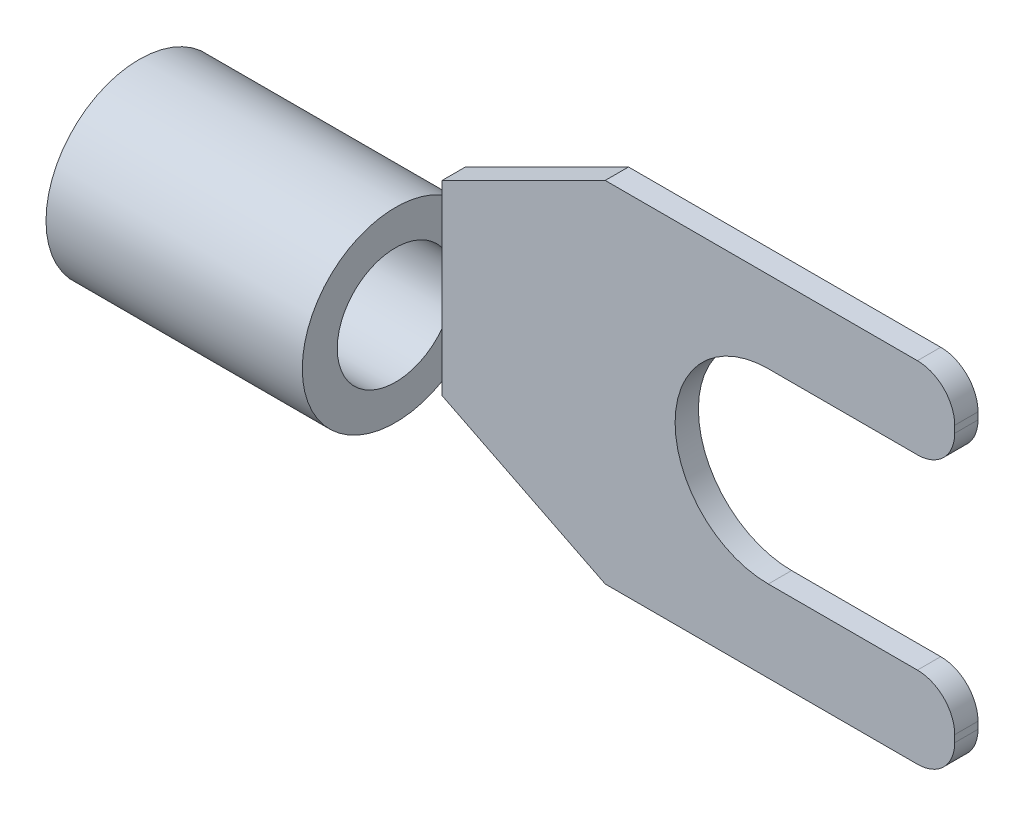
ISO-10303-21;
HEADER;
FILE_DESCRIPTION(('STEP AP214'),'2;1');
FILE_NAME('part.step','',(''),(''),'','','');
FILE_SCHEMA(('AUTOMOTIVE_DESIGN { 1 0 10303 214 1 1 1 1 }'));
ENDSEC;
DATA;
#1=APPLICATION_CONTEXT('core data for automotive mechanical design processes');
#2=APPLICATION_PROTOCOL_DEFINITION('international standard','automotive_design',2000,#1);
#3=PRODUCT_CONTEXT('',#1,'mechanical');
#4=PRODUCT('Part','Part','',(#3));
#5=PRODUCT_RELATED_PRODUCT_CATEGORY('part','',(#4));
#6=PRODUCT_DEFINITION_FORMATION('','',#4);
#7=PRODUCT_DEFINITION_CONTEXT('part definition',#1,'design');
#8=PRODUCT_DEFINITION('design','',#6,#7);
#9=PRODUCT_DEFINITION_SHAPE('','',#8);
#10=(LENGTH_UNIT() NAMED_UNIT(*) SI_UNIT(.MILLI.,.METRE.));
#11=(NAMED_UNIT(*) PLANE_ANGLE_UNIT() SI_UNIT($,.RADIAN.));
#12=(NAMED_UNIT(*) SI_UNIT($,.STERADIAN.) SOLID_ANGLE_UNIT());
#13=UNCERTAINTY_MEASURE_WITH_UNIT(LENGTH_MEASURE(1.E-05),#10,'distance_accuracy_value','');
#14=(GEOMETRIC_REPRESENTATION_CONTEXT(3) GLOBAL_UNCERTAINTY_ASSIGNED_CONTEXT((#13)) GLOBAL_UNIT_ASSIGNED_CONTEXT((#10,
#11,#12)) REPRESENTATION_CONTEXT('',''));
#15=CARTESIAN_POINT('',(0.,0.,0.));
#16=DIRECTION('',(0.,0.,1.));
#17=DIRECTION('',(1.,0.,0.));
#18=AXIS2_PLACEMENT_3D('',#15,#16,#17);
#19=CARTESIAN_POINT('',(0.,0.,0.5));
#20=DIRECTION('',(0.,0.,1.));
#21=DIRECTION('',(1.,0.,0.));
#22=AXIS2_PLACEMENT_3D('',#19,#20,#21);
#23=PLANE('',#22);
#24=DIRECTION('',(-0.894427190999916,-0.447213595499958,0.));
#25=VECTOR('',#24,1.);
#26=CARTESIAN_POINT('',(-3.5,3.75,0.5));
#27=LINE('',#26,#25);
#28=CARTESIAN_POINT('',(-3.5,3.75,0.5));
#29=VERTEX_POINT('',#28);
#30=CARTESIAN_POINT('',(-7.,2.,0.5));
#31=VERTEX_POINT('',#30);
#32=EDGE_CURVE('E256',#29,#31,#27,.T.);
#33=ORIENTED_EDGE('',*,*,#32,.T.);
#34=DIRECTION('',(0.,-1.,0.));
#35=VECTOR('',#34,1.);
#36=CARTESIAN_POINT('',(-7.,0.,0.5));
#37=LINE('',#36,#35);
#38=CARTESIAN_POINT('',(-7.,1.73205080756888,0.5));
#39=VERTEX_POINT('',#38);
#40=EDGE_CURVE('E294',#31,#39,#37,.T.);
#41=ORIENTED_EDGE('',*,*,#40,.T.);
#42=DIRECTION('',(0.,-1.,0.));
#43=VECTOR('',#42,1.);
#44=CARTESIAN_POINT('',(-7.,0.,0.5));
#45=LINE('',#44,#43);
#46=CARTESIAN_POINT('',(-7.,0.749999999999999,0.5));
#47=VERTEX_POINT('',#46);
#48=EDGE_CURVE('E174',#39,#47,#45,.T.);
#49=ORIENTED_EDGE('',*,*,#48,.T.);
#50=DIRECTION('',(0.,-1.,0.));
#51=VECTOR('',#50,1.);
#52=CARTESIAN_POINT('',(-7.,0.,0.5));
#53=LINE('',#52,#51);
#54=CARTESIAN_POINT('',(-7.,-0.749999999999999,0.5));
#55=VERTEX_POINT('',#54);
#56=EDGE_CURVE('E289',#47,#55,#53,.T.);
#57=ORIENTED_EDGE('',*,*,#56,.T.);
#58=CARTESIAN_POINT('',(-7.,-1.73205080756888,0.5));
#59=VERTEX_POINT('',#58);
#60=EDGE_CURVE('E275',#55,#59,#45,.T.);
#61=ORIENTED_EDGE('',*,*,#60,.T.);
#62=CARTESIAN_POINT('',(-7.,-2.,0.5));
#63=VERTEX_POINT('',#62);
#64=EDGE_CURVE('E295',#59,#63,#37,.T.);
#65=ORIENTED_EDGE('',*,*,#64,.T.);
#66=DIRECTION('',(0.894427190999916,-0.447213595499958,0.));
#67=VECTOR('',#66,1.);
#68=CARTESIAN_POINT('',(-3.5,-3.75,0.5));
#69=LINE('',#68,#67);
#70=CARTESIAN_POINT('',(-3.5,-3.75,0.5));
#71=VERTEX_POINT('',#70);
#72=EDGE_CURVE('E258',#63,#71,#69,.T.);
#73=ORIENTED_EDGE('',*,*,#72,.T.);
#74=DIRECTION('',(1.,0.,0.));
#75=VECTOR('',#74,1.);
#76=CARTESIAN_POINT('',(-3.5,-3.75,0.5));
#77=LINE('',#76,#75);
#78=CARTESIAN_POINT('',(3.2,-3.75,0.5));
#79=VERTEX_POINT('',#78);
#80=EDGE_CURVE('E260',#71,#79,#77,.T.);
#81=ORIENTED_EDGE('',*,*,#80,.T.);
#82=CARTESIAN_POINT('',(3.2,-2.95,0.5));
#83=DIRECTION('',(0.,0.,1.));
#84=DIRECTION('',(-1.,0.,0.));
#85=AXIS2_PLACEMENT_3D('',#82,#83,#84);
#86=CIRCLE('',#85,0.8);
#87=CARTESIAN_POINT('',(4.,-2.95,0.5));
#88=VERTEX_POINT('',#87);
#89=EDGE_CURVE('E149',#79,#88,#86,.T.);
#90=ORIENTED_EDGE('',*,*,#89,.T.);
#91=DIRECTION('',(0.,1.,0.));
#92=VECTOR('',#91,1.);
#93=CARTESIAN_POINT('',(4.,-2.95,0.5));
#94=LINE('',#93,#92);
#95=CARTESIAN_POINT('',(4.,-2.8,0.5));
#96=VERTEX_POINT('',#95);
#97=EDGE_CURVE('E142',#88,#96,#94,.T.);
#98=ORIENTED_EDGE('',*,*,#97,.T.);
#99=CARTESIAN_POINT('',(3.2,-2.8,0.5));
#100=DIRECTION('',(0.,0.,1.));
#101=DIRECTION('',(1.,0.,0.));
#102=AXIS2_PLACEMENT_3D('',#99,#100,#101);
#103=CIRCLE('',#102,0.8);
#104=CARTESIAN_POINT('',(3.2,-2.,0.5));
#105=VERTEX_POINT('',#104);
#106=EDGE_CURVE('E146',#96,#105,#103,.T.);
#107=ORIENTED_EDGE('',*,*,#106,.T.);
#108=DIRECTION('',(-1.,0.,0.));
#109=VECTOR('',#108,1.);
#110=CARTESIAN_POINT('',(0.,-2.,0.5));
#111=LINE('',#110,#109);
#112=CARTESIAN_POINT('',(0.,-2.,0.5));
#113=VERTEX_POINT('',#112);
#114=EDGE_CURVE('E58',#105,#113,#111,.T.);
#115=ORIENTED_EDGE('',*,*,#114,.T.);
#116=CARTESIAN_POINT('',(0.,0.,0.5));
#117=DIRECTION('',(0.,0.,-1.));
#118=DIRECTION('',(1.,0.,0.));
#119=AXIS2_PLACEMENT_3D('',#116,#117,#118);
#120=CIRCLE('',#119,2.);
#121=CARTESIAN_POINT('',(0.,2.,0.5));
#122=VERTEX_POINT('',#121);
#123=EDGE_CURVE('E197',#113,#122,#120,.T.);
#124=ORIENTED_EDGE('',*,*,#123,.T.);
#125=DIRECTION('',(1.,0.,0.));
#126=VECTOR('',#125,1.);
#127=CARTESIAN_POINT('',(0.,2.,0.5));
#128=LINE('',#127,#126);
#129=CARTESIAN_POINT('',(3.2,2.,0.5));
#130=VERTEX_POINT('',#129);
#131=EDGE_CURVE('E115',#122,#130,#128,.T.);
#132=ORIENTED_EDGE('',*,*,#131,.T.);
#133=CARTESIAN_POINT('',(3.2,2.8,0.5));
#134=DIRECTION('',(0.,0.,1.));
#135=DIRECTION('',(-1.,0.,0.));
#136=AXIS2_PLACEMENT_3D('',#133,#134,#135);
#137=CIRCLE('',#136,0.8);
#138=CARTESIAN_POINT('',(4.,2.8,0.5));
#139=VERTEX_POINT('',#138);
#140=EDGE_CURVE('E248',#130,#139,#137,.T.);
#141=ORIENTED_EDGE('',*,*,#140,.T.);
#142=DIRECTION('',(0.,1.,0.));
#143=VECTOR('',#142,1.);
#144=CARTESIAN_POINT('',(4.,2.95,0.5));
#145=LINE('',#144,#143);
#146=CARTESIAN_POINT('',(4.,2.95,0.5));
#147=VERTEX_POINT('',#146);
#148=EDGE_CURVE('E245',#139,#147,#145,.T.);
#149=ORIENTED_EDGE('',*,*,#148,.T.);
#150=CARTESIAN_POINT('',(3.2,2.95,0.5));
#151=DIRECTION('',(0.,0.,1.));
#152=DIRECTION('',(1.,0.,0.));
#153=AXIS2_PLACEMENT_3D('',#150,#151,#152);
#154=CIRCLE('',#153,0.8);
#155=CARTESIAN_POINT('',(3.2,3.75,0.5));
#156=VERTEX_POINT('',#155);
#157=EDGE_CURVE('E247',#147,#156,#154,.T.);
#158=ORIENTED_EDGE('',*,*,#157,.T.);
#159=DIRECTION('',(-1.,0.,0.));
#160=VECTOR('',#159,1.);
#161=CARTESIAN_POINT('',(-3.5,3.75,0.5));
#162=LINE('',#161,#160);
#163=EDGE_CURVE('E250',#156,#29,#162,.T.);
#164=ORIENTED_EDGE('',*,*,#163,.T.);
#165=EDGE_LOOP('',(#33,#41,#49,#57,#61,#65,#73,#81,#90,#98,#107,#115,#124,#132,#141,#149,#158,#164));
#166=FACE_BOUND('',#165,.T.);
#167=ADVANCED_FACE('F35',(#166),#23,.T.);
#168=CARTESIAN_POINT('',(-12.5,2.,0.5));
#169=DIRECTION('',(1.,0.,0.));
#170=DIRECTION('',(0.,0.,-1.));
#171=AXIS2_PLACEMENT_3D('',#168,#169,#170);
#172=PLANE('',#171);
#173=CARTESIAN_POINT('',(-12.5,0.,1.5));
#174=DIRECTION('',(-1.,0.,0.));
#175=DIRECTION('',(0.,0.,1.));
#176=AXIS2_PLACEMENT_3D('',#173,#174,#175);
#177=CIRCLE('',#176,1.25);
#178=CARTESIAN_POINT('',(-12.5,0.,2.75));
#179=VERTEX_POINT('',#178);
#180=EDGE_CURVE('E286',#179,#179,#177,.T.);
#181=ORIENTED_EDGE('',*,*,#180,.F.);
#182=EDGE_LOOP('',(#181));
#183=FACE_BOUND('',#182,.T.);
#184=CARTESIAN_POINT('',(-12.5,0.,1.5));
#185=DIRECTION('',(-1.,0.,0.));
#186=DIRECTION('',(0.,0.,1.));
#187=AXIS2_PLACEMENT_3D('',#184,#185,#186);
#188=CIRCLE('',#187,2.);
#189=CARTESIAN_POINT('',(-12.5,0.,3.5));
#190=VERTEX_POINT('',#189);
#191=EDGE_CURVE('E279',#190,#190,#188,.T.);
#192=ORIENTED_EDGE('',*,*,#191,.T.);
#193=EDGE_LOOP('',(#192));
#194=FACE_BOUND('',#193,.T.);
#195=ADVANCED_FACE('F363',(#183,#194),#172,.F.);
#196=CARTESIAN_POINT('',(0.,0.,0.));
#197=DIRECTION('',(0.,0.,1.));
#198=DIRECTION('',(1.,0.,0.));
#199=AXIS2_PLACEMENT_3D('',#196,#197,#198);
#200=PLANE('',#199);
#201=DIRECTION('',(0.,-1.,0.));
#202=VECTOR('',#201,1.);
#203=CARTESIAN_POINT('',(-7.,0.,0.));
#204=LINE('',#203,#202);
#205=CARTESIAN_POINT('',(-7.,2.,0.));
#206=VERTEX_POINT('',#205);
#207=CARTESIAN_POINT('',(-7.,1.3228756555323,0.));
#208=VERTEX_POINT('',#207);
#209=EDGE_CURVE('E297',#206,#208,#204,.T.);
#210=ORIENTED_EDGE('',*,*,#209,.F.);
#211=DIRECTION('',(-0.894427190999916,-0.447213595499958,0.));
#212=VECTOR('',#211,1.);
#213=CARTESIAN_POINT('',(-3.5,3.75,0.));
#214=LINE('',#213,#212);
#215=CARTESIAN_POINT('',(-3.5,3.75,0.));
#216=VERTEX_POINT('',#215);
#217=EDGE_CURVE('E184',#216,#206,#214,.T.);
#218=ORIENTED_EDGE('',*,*,#217,.F.);
#219=DIRECTION('',(-1.,0.,0.));
#220=VECTOR('',#219,1.);
#221=CARTESIAN_POINT('',(-3.5,3.75,0.));
#222=LINE('',#221,#220);
#223=CARTESIAN_POINT('',(3.2,3.75,0.));
#224=VERTEX_POINT('',#223);
#225=EDGE_CURVE('E182',#224,#216,#222,.T.);
#226=ORIENTED_EDGE('',*,*,#225,.F.);
#227=CARTESIAN_POINT('',(3.2,2.95,0.));
#228=DIRECTION('',(0.,0.,1.));
#229=DIRECTION('',(1.,0.,0.));
#230=AXIS2_PLACEMENT_3D('',#227,#228,#229);
#231=CIRCLE('',#230,0.8);
#232=CARTESIAN_POINT('',(4.,2.95,0.));
#233=VERTEX_POINT('',#232);
#234=EDGE_CURVE('E180',#233,#224,#231,.T.);
#235=ORIENTED_EDGE('',*,*,#234,.F.);
#236=DIRECTION('',(0.,1.,0.));
#237=VECTOR('',#236,1.);
#238=CARTESIAN_POINT('',(4.,2.95,0.));
#239=LINE('',#238,#237);
#240=CARTESIAN_POINT('',(4.,2.8,0.));
#241=VERTEX_POINT('',#240);
#242=EDGE_CURVE('E178',#241,#233,#239,.T.);
#243=ORIENTED_EDGE('',*,*,#242,.F.);
#244=CARTESIAN_POINT('',(3.2,2.8,0.));
#245=DIRECTION('',(0.,0.,1.));
#246=DIRECTION('',(-1.,0.,0.));
#247=AXIS2_PLACEMENT_3D('',#244,#245,#246);
#248=CIRCLE('',#247,0.8);
#249=CARTESIAN_POINT('',(3.2,2.,0.));
#250=VERTEX_POINT('',#249);
#251=EDGE_CURVE('E176',#250,#241,#248,.T.);
#252=ORIENTED_EDGE('',*,*,#251,.F.);
#253=DIRECTION('',(1.,0.,0.));
#254=VECTOR('',#253,1.);
#255=CARTESIAN_POINT('',(0.,2.,0.));
#256=LINE('',#255,#254);
#257=CARTESIAN_POINT('',(0.,2.,0.));
#258=VERTEX_POINT('',#257);
#259=EDGE_CURVE('E173',#258,#250,#256,.T.);
#260=ORIENTED_EDGE('',*,*,#259,.F.);
#261=CARTESIAN_POINT('',(0.,0.,0.));
#262=DIRECTION('',(0.,0.,-1.));
#263=DIRECTION('',(1.,0.,0.));
#264=AXIS2_PLACEMENT_3D('',#261,#262,#263);
#265=CIRCLE('',#264,2.);
#266=CARTESIAN_POINT('',(0.,-2.,0.));
#267=VERTEX_POINT('',#266);
#268=EDGE_CURVE('E170',#267,#258,#265,.T.);
#269=ORIENTED_EDGE('',*,*,#268,.F.);
#270=DIRECTION('',(-1.,0.,0.));
#271=VECTOR('',#270,1.);
#272=CARTESIAN_POINT('',(0.,-2.,0.));
#273=LINE('',#272,#271);
#274=CARTESIAN_POINT('',(3.2,-2.,0.));
#275=VERTEX_POINT('',#274);
#276=EDGE_CURVE('E106',#275,#267,#273,.T.);
#277=ORIENTED_EDGE('',*,*,#276,.F.);
#278=CARTESIAN_POINT('',(3.2,-2.8,0.));
#279=DIRECTION('',(0.,0.,1.));
#280=DIRECTION('',(1.,0.,0.));
#281=AXIS2_PLACEMENT_3D('',#278,#279,#280);
#282=CIRCLE('',#281,0.8);
#283=CARTESIAN_POINT('',(4.,-2.8,0.));
#284=VERTEX_POINT('',#283);
#285=EDGE_CURVE('E194',#284,#275,#282,.T.);
#286=ORIENTED_EDGE('',*,*,#285,.F.);
#287=DIRECTION('',(0.,1.,0.));
#288=VECTOR('',#287,1.);
#289=CARTESIAN_POINT('',(4.,-2.95,0.));
#290=LINE('',#289,#288);
#291=CARTESIAN_POINT('',(4.,-2.95,0.));
#292=VERTEX_POINT('',#291);
#293=EDGE_CURVE('E158',#292,#284,#290,.T.);
#294=ORIENTED_EDGE('',*,*,#293,.F.);
#295=CARTESIAN_POINT('',(3.2,-2.95,0.));
#296=DIRECTION('',(0.,0.,1.));
#297=DIRECTION('',(-1.,0.,0.));
#298=AXIS2_PLACEMENT_3D('',#295,#296,#297);
#299=CIRCLE('',#298,0.8);
#300=CARTESIAN_POINT('',(3.2,-3.75,0.));
#301=VERTEX_POINT('',#300);
#302=EDGE_CURVE('E191',#301,#292,#299,.T.);
#303=ORIENTED_EDGE('',*,*,#302,.F.);
#304=DIRECTION('',(1.,0.,0.));
#305=VECTOR('',#304,1.);
#306=CARTESIAN_POINT('',(-3.5,-3.75,0.));
#307=LINE('',#306,#305);
#308=CARTESIAN_POINT('',(-3.5,-3.75,0.));
#309=VERTEX_POINT('',#308);
#310=EDGE_CURVE('E189',#309,#301,#307,.T.);
#311=ORIENTED_EDGE('',*,*,#310,.F.);
#312=DIRECTION('',(0.894427190999916,-0.447213595499958,0.));
#313=VECTOR('',#312,1.);
#314=CARTESIAN_POINT('',(-3.5,-3.75,0.));
#315=LINE('',#314,#313);
#316=CARTESIAN_POINT('',(-7.,-2.,0.));
#317=VERTEX_POINT('',#316);
#318=EDGE_CURVE('E187',#317,#309,#315,.T.);
#319=ORIENTED_EDGE('',*,*,#318,.F.);
#320=CARTESIAN_POINT('',(-7.,-1.3228756555323,0.));
#321=VERTEX_POINT('',#320);
#322=EDGE_CURVE('E298',#321,#317,#204,.T.);
#323=ORIENTED_EDGE('',*,*,#322,.F.);
#324=DIRECTION('',(0.,-1.,0.));
#325=VECTOR('',#324,1.);
#326=CARTESIAN_POINT('',(-7.,0.,0.));
#327=LINE('',#326,#325);
#328=EDGE_CURVE('E11',#208,#321,#327,.T.);
#329=ORIENTED_EDGE('',*,*,#328,.F.);
#330=EDGE_LOOP('',(#210,#218,#226,#235,#243,#252,#260,#269,#277,#286,#294,#303,#311,#319,#323,#329));
#331=FACE_BOUND('',#330,.T.);
#332=ADVANCED_FACE('F233',(#331),#200,.F.);
#333=CARTESIAN_POINT('',(0.,0.,0.5));
#334=DIRECTION('',(0.,0.,-1.));
#335=DIRECTION('',(-1.,0.,0.));
#336=AXIS2_PLACEMENT_3D('',#333,#334,#335);
#337=CYLINDRICAL_SURFACE('',#336,2.);
#338=ORIENTED_EDGE('',*,*,#268,.T.);
#339=DIRECTION('',(0.,0.,-1.));
#340=VECTOR('',#339,1.);
#341=CARTESIAN_POINT('',(0.,2.,0.5));
#342=LINE('',#341,#340);
#343=EDGE_CURVE('E43',#122,#258,#342,.T.);
#344=ORIENTED_EDGE('',*,*,#343,.F.);
#345=ORIENTED_EDGE('',*,*,#123,.F.);
#346=DIRECTION('',(0.,0.,-1.));
#347=VECTOR('',#346,1.);
#348=CARTESIAN_POINT('',(0.,-2.,0.5));
#349=LINE('',#348,#347);
#350=EDGE_CURVE('E166',#113,#267,#349,.T.);
#351=ORIENTED_EDGE('',*,*,#350,.T.);
#352=EDGE_LOOP('',(#338,#344,#345,#351));
#353=FACE_BOUND('',#352,.T.);
#354=ADVANCED_FACE('F37',(#353),#337,.F.);
#355=CARTESIAN_POINT('',(0.,2.,0.5));
#356=DIRECTION('',(0.,1.,0.));
#357=DIRECTION('',(0.,0.,1.));
#358=AXIS2_PLACEMENT_3D('',#355,#356,#357);
#359=PLANE('',#358);
#360=ORIENTED_EDGE('',*,*,#259,.T.);
#361=DIRECTION('',(0.,0.,-1.));
#362=VECTOR('',#361,1.);
#363=CARTESIAN_POINT('',(3.2,2.,0.5));
#364=LINE('',#363,#362);
#365=EDGE_CURVE('E224',#130,#250,#364,.T.);
#366=ORIENTED_EDGE('',*,*,#365,.F.);
#367=ORIENTED_EDGE('',*,*,#131,.F.);
#368=ORIENTED_EDGE('',*,*,#343,.T.);
#369=EDGE_LOOP('',(#360,#366,#367,#368));
#370=FACE_BOUND('',#369,.T.);
#371=ADVANCED_FACE('F227',(#370),#359,.F.);
#372=CARTESIAN_POINT('',(3.2,2.8,0.5));
#373=DIRECTION('',(0.,0.,-1.));
#374=DIRECTION('',(-1.,0.,0.));
#375=AXIS2_PLACEMENT_3D('',#372,#373,#374);
#376=CYLINDRICAL_SURFACE('',#375,0.8);
#377=ORIENTED_EDGE('',*,*,#251,.T.);
#378=DIRECTION('',(0.,0.,-1.));
#379=VECTOR('',#378,1.);
#380=CARTESIAN_POINT('',(4.,2.8,0.5));
#381=LINE('',#380,#379);
#382=EDGE_CURVE('E221',#139,#241,#381,.T.);
#383=ORIENTED_EDGE('',*,*,#382,.F.);
#384=ORIENTED_EDGE('',*,*,#140,.F.);
#385=ORIENTED_EDGE('',*,*,#365,.T.);
#386=EDGE_LOOP('',(#377,#383,#384,#385));
#387=FACE_BOUND('',#386,.T.);
#388=ADVANCED_FACE('F239',(#387),#376,.T.);
#389=CARTESIAN_POINT('',(4.,2.95,0.5));
#390=DIRECTION('',(-1.,0.,0.));
#391=DIRECTION('',(0.,0.,1.));
#392=AXIS2_PLACEMENT_3D('',#389,#390,#391);
#393=PLANE('',#392);
#394=ORIENTED_EDGE('',*,*,#242,.T.);
#395=DIRECTION('',(0.,0.,-1.));
#396=VECTOR('',#395,1.);
#397=CARTESIAN_POINT('',(4.,2.95,0.5));
#398=LINE('',#397,#396);
#399=EDGE_CURVE('E218',#147,#233,#398,.T.);
#400=ORIENTED_EDGE('',*,*,#399,.F.);
#401=ORIENTED_EDGE('',*,*,#148,.F.);
#402=ORIENTED_EDGE('',*,*,#382,.T.);
#403=EDGE_LOOP('',(#394,#400,#401,#402));
#404=FACE_BOUND('',#403,.T.);
#405=ADVANCED_FACE('F243',(#404),#393,.F.);
#406=CARTESIAN_POINT('',(3.2,2.95,0.5));
#407=DIRECTION('',(0.,0.,-1.));
#408=DIRECTION('',(-1.,0.,0.));
#409=AXIS2_PLACEMENT_3D('',#406,#407,#408);
#410=CYLINDRICAL_SURFACE('',#409,0.8);
#411=ORIENTED_EDGE('',*,*,#234,.T.);
#412=DIRECTION('',(0.,0.,-1.));
#413=VECTOR('',#412,1.);
#414=CARTESIAN_POINT('',(3.2,3.75,0.5));
#415=LINE('',#414,#413);
#416=EDGE_CURVE('E215',#156,#224,#415,.T.);
#417=ORIENTED_EDGE('',*,*,#416,.F.);
#418=ORIENTED_EDGE('',*,*,#157,.F.);
#419=ORIENTED_EDGE('',*,*,#399,.T.);
#420=EDGE_LOOP('',(#411,#417,#418,#419));
#421=FACE_BOUND('',#420,.T.);
#422=ADVANCED_FACE('F390',(#421),#410,.T.);
#423=CARTESIAN_POINT('',(-3.5,3.75,0.5));
#424=DIRECTION('',(0.,-1.,0.));
#425=DIRECTION('',(0.,0.,-1.));
#426=AXIS2_PLACEMENT_3D('',#423,#424,#425);
#427=PLANE('',#426);
#428=ORIENTED_EDGE('',*,*,#225,.T.);
#429=DIRECTION('',(0.,0.,-1.));
#430=VECTOR('',#429,1.);
#431=CARTESIAN_POINT('',(-3.5,3.75,0.5));
#432=LINE('',#431,#430);
#433=EDGE_CURVE('E212',#29,#216,#432,.T.);
#434=ORIENTED_EDGE('',*,*,#433,.F.);
#435=ORIENTED_EDGE('',*,*,#163,.F.);
#436=ORIENTED_EDGE('',*,*,#416,.T.);
#437=EDGE_LOOP('',(#428,#434,#435,#436));
#438=FACE_BOUND('',#437,.T.);
#439=ADVANCED_FACE('F386',(#438),#427,.F.);
#440=CARTESIAN_POINT('',(-3.5,3.75,0.5));
#441=DIRECTION('',(0.447213595499958,-0.894427190999916,0.));
#442=DIRECTION('',(0.894427190999916,0.447213595499958,0.));
#443=AXIS2_PLACEMENT_3D('',#440,#441,#442);
#444=PLANE('',#443);
#445=ORIENTED_EDGE('',*,*,#217,.T.);
#446=DIRECTION('',(0.,0.,-1.));
#447=VECTOR('',#446,1.);
#448=CARTESIAN_POINT('',(-7.,2.,0.5));
#449=LINE('',#448,#447);
#450=EDGE_CURVE('E210',#31,#206,#449,.T.);
#451=ORIENTED_EDGE('',*,*,#450,.F.);
#452=ORIENTED_EDGE('',*,*,#32,.F.);
#453=ORIENTED_EDGE('',*,*,#433,.T.);
#454=EDGE_LOOP('',(#445,#451,#452,#453));
#455=FACE_BOUND('',#454,.T.);
#456=ADVANCED_FACE('F382',(#455),#444,.F.);
#457=CARTESIAN_POINT('',(-3.5,-3.75,0.5));
#458=DIRECTION('',(0.447213595499958,0.894427190999916,0.));
#459=DIRECTION('',(-0.894427190999916,0.447213595499958,0.));
#460=AXIS2_PLACEMENT_3D('',#457,#458,#459);
#461=PLANE('',#460);
#462=ORIENTED_EDGE('',*,*,#318,.T.);
#463=DIRECTION('',(0.,0.,-1.));
#464=VECTOR('',#463,1.);
#465=CARTESIAN_POINT('',(-3.5,-3.75,0.5));
#466=LINE('',#465,#464);
#467=EDGE_CURVE('E204',#71,#309,#466,.T.);
#468=ORIENTED_EDGE('',*,*,#467,.F.);
#469=ORIENTED_EDGE('',*,*,#72,.F.);
#470=DIRECTION('',(0.,0.,-1.));
#471=VECTOR('',#470,1.);
#472=CARTESIAN_POINT('',(-7.,-2.,0.5));
#473=LINE('',#472,#471);
#474=EDGE_CURVE('E207',#63,#317,#473,.T.);
#475=ORIENTED_EDGE('',*,*,#474,.T.);
#476=EDGE_LOOP('',(#462,#468,#469,#475));
#477=FACE_BOUND('',#476,.T.);
#478=ADVANCED_FACE('F346',(#477),#461,.F.);
#479=CARTESIAN_POINT('',(-3.5,-3.75,0.5));
#480=DIRECTION('',(0.,1.,0.));
#481=DIRECTION('',(0.,0.,1.));
#482=AXIS2_PLACEMENT_3D('',#479,#480,#481);
#483=PLANE('',#482);
#484=ORIENTED_EDGE('',*,*,#310,.T.);
#485=DIRECTION('',(0.,0.,-1.));
#486=VECTOR('',#485,1.);
#487=CARTESIAN_POINT('',(3.2,-3.75,0.5));
#488=LINE('',#487,#486);
#489=EDGE_CURVE('E201',#79,#301,#488,.T.);
#490=ORIENTED_EDGE('',*,*,#489,.F.);
#491=ORIENTED_EDGE('',*,*,#80,.F.);
#492=ORIENTED_EDGE('',*,*,#467,.T.);
#493=EDGE_LOOP('',(#484,#490,#491,#492));
#494=FACE_BOUND('',#493,.T.);
#495=ADVANCED_FACE('F267',(#494),#483,.F.);
#496=CARTESIAN_POINT('',(3.2,-2.95,0.5));
#497=DIRECTION('',(0.,0.,-1.));
#498=DIRECTION('',(-1.,0.,0.));
#499=AXIS2_PLACEMENT_3D('',#496,#497,#498);
#500=CYLINDRICAL_SURFACE('',#499,0.8);
#501=ORIENTED_EDGE('',*,*,#302,.T.);
#502=DIRECTION('',(0.,0.,-1.));
#503=VECTOR('',#502,1.);
#504=CARTESIAN_POINT('',(4.,-2.95,0.5));
#505=LINE('',#504,#503);
#506=EDGE_CURVE('E161',#88,#292,#505,.T.);
#507=ORIENTED_EDGE('',*,*,#506,.F.);
#508=ORIENTED_EDGE('',*,*,#89,.F.);
#509=ORIENTED_EDGE('',*,*,#489,.T.);
#510=EDGE_LOOP('',(#501,#507,#508,#509));
#511=FACE_BOUND('',#510,.T.);
#512=ADVANCED_FACE('F271',(#511),#500,.T.);
#513=CARTESIAN_POINT('',(4.,-2.95,0.5));
#514=DIRECTION('',(-1.,0.,0.));
#515=DIRECTION('',(0.,0.,1.));
#516=AXIS2_PLACEMENT_3D('',#513,#514,#515);
#517=PLANE('',#516);
#518=ORIENTED_EDGE('',*,*,#293,.T.);
#519=DIRECTION('',(0.,0.,-1.));
#520=VECTOR('',#519,1.);
#521=CARTESIAN_POINT('',(4.,-2.8,0.5));
#522=LINE('',#521,#520);
#523=EDGE_CURVE('E155',#96,#284,#522,.T.);
#524=ORIENTED_EDGE('',*,*,#523,.F.);
#525=ORIENTED_EDGE('',*,*,#97,.F.);
#526=ORIENTED_EDGE('',*,*,#506,.T.);
#527=EDGE_LOOP('',(#518,#524,#525,#526));
#528=FACE_BOUND('',#527,.T.);
#529=ADVANCED_FACE('F156',(#528),#517,.F.);
#530=CARTESIAN_POINT('',(3.2,-2.8,0.5));
#531=DIRECTION('',(0.,0.,-1.));
#532=DIRECTION('',(-1.,0.,0.));
#533=AXIS2_PLACEMENT_3D('',#530,#531,#532);
#534=CYLINDRICAL_SURFACE('',#533,0.8);
#535=ORIENTED_EDGE('',*,*,#285,.T.);
#536=DIRECTION('',(0.,0.,-1.));
#537=VECTOR('',#536,1.);
#538=CARTESIAN_POINT('',(3.2,-2.,0.5));
#539=LINE('',#538,#537);
#540=EDGE_CURVE('E162',#105,#275,#539,.T.);
#541=ORIENTED_EDGE('',*,*,#540,.F.);
#542=ORIENTED_EDGE('',*,*,#106,.F.);
#543=ORIENTED_EDGE('',*,*,#523,.T.);
#544=EDGE_LOOP('',(#535,#541,#542,#543));
#545=FACE_BOUND('',#544,.T.);
#546=ADVANCED_FACE('F164',(#545),#534,.T.);
#547=CARTESIAN_POINT('',(0.,-2.,0.5));
#548=DIRECTION('',(0.,-1.,0.));
#549=DIRECTION('',(0.,0.,-1.));
#550=AXIS2_PLACEMENT_3D('',#547,#548,#549);
#551=PLANE('',#550);
#552=ORIENTED_EDGE('',*,*,#276,.T.);
#553=ORIENTED_EDGE('',*,*,#350,.F.);
#554=ORIENTED_EDGE('',*,*,#114,.F.);
#555=ORIENTED_EDGE('',*,*,#540,.T.);
#556=EDGE_LOOP('',(#552,#553,#554,#555));
#557=FACE_BOUND('',#556,.T.);
#558=ADVANCED_FACE('F272',(#557),#551,.F.);
#559=CARTESIAN_POINT('',(-7.,0.,1.5));
#560=DIRECTION('',(-1.,0.,0.));
#561=DIRECTION('',(0.,0.,1.));
#562=AXIS2_PLACEMENT_3D('',#559,#560,#561);
#563=PLANE('',#562);
#564=CARTESIAN_POINT('',(-7.,0.,1.5));
#565=DIRECTION('',(-1.,0.,0.));
#566=DIRECTION('',(0.,0.,1.));
#567=AXIS2_PLACEMENT_3D('',#564,#565,#566);
#568=CIRCLE('',#567,2.);
#569=EDGE_CURVE('E278',#208,#321,#568,.T.);
#570=ORIENTED_EDGE('',*,*,#569,.F.);
#571=ORIENTED_EDGE('',*,*,#328,.T.);
#572=EDGE_LOOP('',(#570,#571));
#573=FACE_BOUND('',#572,.T.);
#574=ADVANCED_FACE('F350',(#573),#563,.F.);
#575=CARTESIAN_POINT('',(-7.,0.,1.5));
#576=DIRECTION('',(-1.,0.,0.));
#577=DIRECTION('',(0.,0.,1.));
#578=AXIS2_PLACEMENT_3D('',#575,#576,#577);
#579=CYLINDRICAL_SURFACE('',#578,2.);
#580=ORIENTED_EDGE('',*,*,#191,.F.);
#581=EDGE_LOOP('',(#580));
#582=FACE_BOUND('',#581,.T.);
#583=EDGE_CURVE('E282',#59,#39,#568,.T.);
#584=ORIENTED_EDGE('',*,*,#583,.T.);
#585=CARTESIAN_POINT('',(-7.,0.,1.5));
#586=DIRECTION('',(-1.,0.,0.));
#587=DIRECTION('',(0.,0.,1.));
#588=AXIS2_PLACEMENT_3D('',#585,#586,#587);
#589=CIRCLE('',#588,2.);
#590=EDGE_CURVE('E303',#208,#39,#589,.F.);
#591=ORIENTED_EDGE('',*,*,#590,.F.);
#592=ORIENTED_EDGE('',*,*,#569,.T.);
#593=EDGE_CURVE('E301',#59,#321,#589,.F.);
#594=ORIENTED_EDGE('',*,*,#593,.F.);
#595=EDGE_LOOP('',(#584,#591,#592,#594));
#596=FACE_BOUND('',#595,.T.);
#597=ADVANCED_FACE('F334',(#582,#596),#579,.T.);
#598=ORIENTED_EDGE('',*,*,#48,.F.);
#599=ORIENTED_EDGE('',*,*,#583,.F.);
#600=ORIENTED_EDGE('',*,*,#60,.F.);
#601=CARTESIAN_POINT('',(-7.,0.,1.5));
#602=DIRECTION('',(-1.,0.,0.));
#603=DIRECTION('',(0.,0.,1.));
#604=AXIS2_PLACEMENT_3D('',#601,#602,#603);
#605=CIRCLE('',#604,1.25);
#606=EDGE_CURVE('E283',#55,#47,#605,.T.);
#607=ORIENTED_EDGE('',*,*,#606,.T.);
#608=EDGE_LOOP('',(#598,#599,#600,#607));
#609=FACE_BOUND('',#608,.T.);
#610=ADVANCED_FACE('F330',(#609),#563,.F.);
#611=CARTESIAN_POINT('',(-7.,0.,1.5));
#612=DIRECTION('',(-1.,0.,0.));
#613=DIRECTION('',(0.,0.,1.));
#614=AXIS2_PLACEMENT_3D('',#611,#612,#613);
#615=CYLINDRICAL_SURFACE('',#614,1.25);
#616=ORIENTED_EDGE('',*,*,#180,.T.);
#617=EDGE_LOOP('',(#616));
#618=FACE_BOUND('',#617,.T.);
#619=CARTESIAN_POINT('',(-7.,0.,1.5));
#620=DIRECTION('',(-1.,0.,0.));
#621=DIRECTION('',(0.,0.,1.));
#622=AXIS2_PLACEMENT_3D('',#619,#620,#621);
#623=CIRCLE('',#622,1.25);
#624=EDGE_CURVE('E49',#55,#47,#623,.F.);
#625=ORIENTED_EDGE('',*,*,#624,.T.);
#626=ORIENTED_EDGE('',*,*,#606,.F.);
#627=EDGE_LOOP('',(#625,#626));
#628=FACE_BOUND('',#627,.T.);
#629=ADVANCED_FACE('F344',(#618,#628),#615,.F.);
#630=CARTESIAN_POINT('',(-7.,0.,1.5));
#631=DIRECTION('',(-1.,0.,0.));
#632=DIRECTION('',(0.,0.,1.));
#633=AXIS2_PLACEMENT_3D('',#630,#631,#632);
#634=PLANE('',#633);
#635=ORIENTED_EDGE('',*,*,#624,.F.);
#636=ORIENTED_EDGE('',*,*,#56,.F.);
#637=EDGE_LOOP('',(#635,#636));
#638=FACE_BOUND('',#637,.T.);
#639=ADVANCED_FACE('F342',(#638),#634,.T.);
#640=CARTESIAN_POINT('',(-7.,0.,1.5));
#641=DIRECTION('',(-1.,0.,0.));
#642=DIRECTION('',(0.,0.,1.));
#643=AXIS2_PLACEMENT_3D('',#640,#641,#642);
#644=PLANE('',#643);
#645=ORIENTED_EDGE('',*,*,#593,.T.);
#646=ORIENTED_EDGE('',*,*,#322,.T.);
#647=ORIENTED_EDGE('',*,*,#474,.F.);
#648=ORIENTED_EDGE('',*,*,#64,.F.);
#649=EDGE_LOOP('',(#645,#646,#647,#648));
#650=FACE_BOUND('',#649,.T.);
#651=ADVANCED_FACE('F428',(#650),#644,.T.);
#652=ORIENTED_EDGE('',*,*,#450,.T.);
#653=ORIENTED_EDGE('',*,*,#209,.T.);
#654=ORIENTED_EDGE('',*,*,#590,.T.);
#655=ORIENTED_EDGE('',*,*,#40,.F.);
#656=EDGE_LOOP('',(#652,#653,#654,#655));
#657=FACE_BOUND('',#656,.T.);
#658=ADVANCED_FACE('F315',(#657),#644,.T.);
#659=CLOSED_SHELL('',(#167,#195,#332,#354,#371,#388,#405,#422,#439,#456,#478,#495,#512,#529,
#546,#558,#574,#597,#610,#629,#639,#651,#658));
#660=MANIFOLD_SOLID_BREP('B2',#659);
#661=ADVANCED_BREP_SHAPE_REPRESENTATION('',(#18,#660),#14);
#662=SHAPE_DEFINITION_REPRESENTATION(#9,#661);
ENDSEC;
END-ISO-10303-21;
